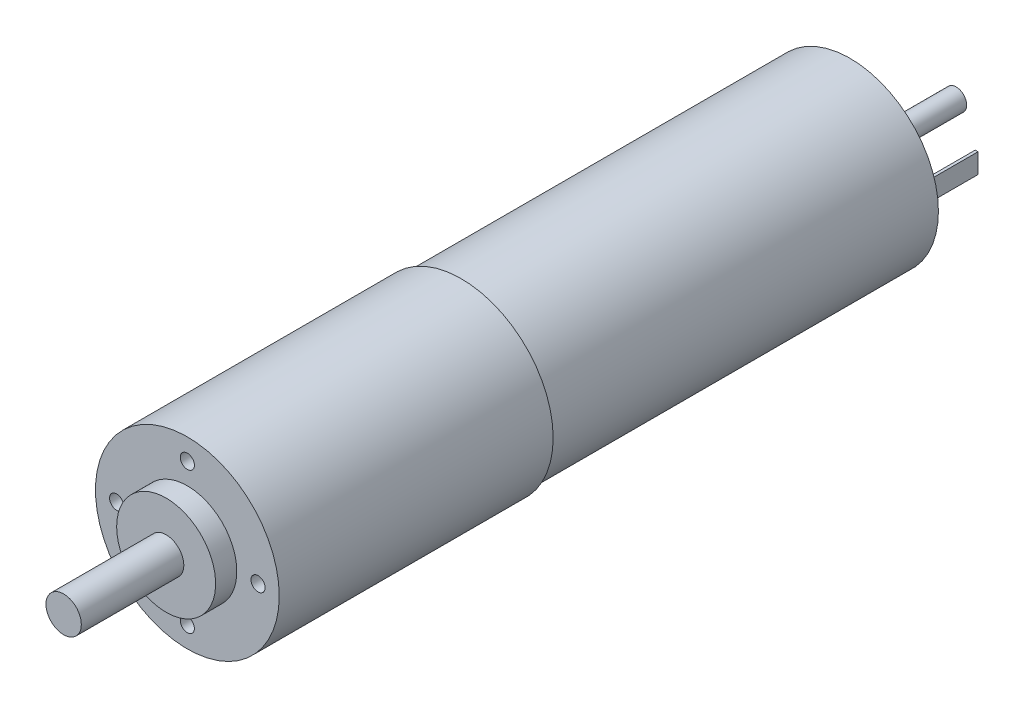
ISO-10303-21;
HEADER;
FILE_DESCRIPTION(('STEP AP214'),'2;1');
FILE_NAME('part.step','',(''),(''),'','','');
FILE_SCHEMA(('AUTOMOTIVE_DESIGN { 1 0 10303 214 1 1 1 1 }'));
ENDSEC;
DATA;
#1=APPLICATION_CONTEXT('core data for automotive mechanical design processes');
#2=APPLICATION_PROTOCOL_DEFINITION('international standard','automotive_design',2000,#1);
#3=PRODUCT_CONTEXT('',#1,'mechanical');
#4=PRODUCT('Part','Part','',(#3));
#5=PRODUCT_RELATED_PRODUCT_CATEGORY('part','',(#4));
#6=PRODUCT_DEFINITION_FORMATION('','',#4);
#7=PRODUCT_DEFINITION_CONTEXT('part definition',#1,'design');
#8=PRODUCT_DEFINITION('design','',#6,#7);
#9=PRODUCT_DEFINITION_SHAPE('','',#8);
#10=(LENGTH_UNIT() NAMED_UNIT(*) SI_UNIT(.MILLI.,.METRE.));
#11=(NAMED_UNIT(*) PLANE_ANGLE_UNIT() SI_UNIT($,.RADIAN.));
#12=(NAMED_UNIT(*) SI_UNIT($,.STERADIAN.) SOLID_ANGLE_UNIT());
#13=UNCERTAINTY_MEASURE_WITH_UNIT(LENGTH_MEASURE(1.E-05),#10,'distance_accuracy_value','');
#14=(GEOMETRIC_REPRESENTATION_CONTEXT(3) GLOBAL_UNCERTAINTY_ASSIGNED_CONTEXT((#13)) GLOBAL_UNIT_ASSIGNED_CONTEXT((#10,
#11,#12)) REPRESENTATION_CONTEXT('',''));
#15=CARTESIAN_POINT('',(0.,0.,0.));
#16=DIRECTION('',(0.,0.,1.));
#17=DIRECTION('',(1.,0.,0.));
#18=AXIS2_PLACEMENT_3D('',#15,#16,#17);
#19=CARTESIAN_POINT('',(0.,0.,0.));
#20=DIRECTION('',(0.,0.,1.));
#21=DIRECTION('',(1.,0.,0.));
#22=AXIS2_PLACEMENT_3D('',#19,#20,#21);
#23=PLANE('',#22);
#24=CARTESIAN_POINT('',(0.,0.,0.));
#25=DIRECTION('',(0.,0.,1.));
#26=DIRECTION('',(1.,0.,0.));
#27=AXIS2_PLACEMENT_3D('',#24,#25,#26);
#28=CIRCLE('',#27,12.5);
#29=CARTESIAN_POINT('',(12.5,0.,0.));
#30=VERTEX_POINT('',#29);
#31=EDGE_CURVE('E210',#30,#30,#28,.T.);
#32=ORIENTED_EDGE('',*,*,#31,.F.);
#33=EDGE_LOOP('',(#32));
#34=FACE_BOUND('',#33,.T.);
#35=CARTESIAN_POINT('',(0.,0.,0.));
#36=DIRECTION('',(0.,0.,-1.));
#37=DIRECTION('',(-1.,0.,0.));
#38=AXIS2_PLACEMENT_3D('',#35,#36,#37);
#39=CIRCLE('',#38,4.);
#40=CARTESIAN_POINT('',(-4.,0.,0.));
#41=VERTEX_POINT('',#40);
#42=EDGE_CURVE('E11',#41,#41,#39,.T.);
#43=ORIENTED_EDGE('',*,*,#42,.F.);
#44=EDGE_LOOP('',(#43));
#45=FACE_BOUND('',#44,.T.);
#46=DIRECTION('',(1.,0.,0.));
#47=VECTOR('',#46,1.);
#48=CARTESIAN_POINT('',(0.,-1.40000000000001,0.));
#49=LINE('',#48,#47);
#50=CARTESIAN_POINT('',(-9.4,-1.4,0.));
#51=VERTEX_POINT('',#50);
#52=CARTESIAN_POINT('',(-9.,-1.4,0.));
#53=VERTEX_POINT('',#52);
#54=EDGE_CURVE('E129',#51,#53,#49,.T.);
#55=ORIENTED_EDGE('',*,*,#54,.T.);
#56=DIRECTION('',(0.,1.,0.));
#57=VECTOR('',#56,1.);
#58=CARTESIAN_POINT('',(-9.,0.,0.));
#59=LINE('',#58,#57);
#60=CARTESIAN_POINT('',(-9.,1.4,0.));
#61=VERTEX_POINT('',#60);
#62=EDGE_CURVE('E126',#53,#61,#59,.T.);
#63=ORIENTED_EDGE('',*,*,#62,.T.);
#64=DIRECTION('',(-1.,0.,0.));
#65=VECTOR('',#64,1.);
#66=CARTESIAN_POINT('',(0.,1.40000000000001,0.));
#67=LINE('',#66,#65);
#68=CARTESIAN_POINT('',(-9.4,1.4,0.));
#69=VERTEX_POINT('',#68);
#70=EDGE_CURVE('E139',#61,#69,#67,.T.);
#71=ORIENTED_EDGE('',*,*,#70,.T.);
#72=DIRECTION('',(0.,-1.,0.));
#73=VECTOR('',#72,1.);
#74=CARTESIAN_POINT('',(-9.4,0.,0.));
#75=LINE('',#74,#73);
#76=EDGE_CURVE('E151',#69,#51,#75,.T.);
#77=ORIENTED_EDGE('',*,*,#76,.T.);
#78=EDGE_LOOP('',(#55,#63,#71,#77));
#79=FACE_BOUND('',#78,.T.);
#80=DIRECTION('',(-1.,0.,0.));
#81=VECTOR('',#80,1.);
#82=CARTESIAN_POINT('',(0.,-1.40000000000001,0.));
#83=LINE('',#82,#81);
#84=CARTESIAN_POINT('',(9.4,-1.4,0.));
#85=VERTEX_POINT('',#84);
#86=CARTESIAN_POINT('',(9.,-1.4,0.));
#87=VERTEX_POINT('',#86);
#88=EDGE_CURVE('E125',#85,#87,#83,.T.);
#89=ORIENTED_EDGE('',*,*,#88,.F.);
#90=DIRECTION('',(0.,-1.,0.));
#91=VECTOR('',#90,1.);
#92=CARTESIAN_POINT('',(9.4,0.,0.));
#93=LINE('',#92,#91);
#94=CARTESIAN_POINT('',(9.4,1.4,0.));
#95=VERTEX_POINT('',#94);
#96=EDGE_CURVE('E122',#95,#85,#93,.T.);
#97=ORIENTED_EDGE('',*,*,#96,.F.);
#98=DIRECTION('',(1.,0.,0.));
#99=VECTOR('',#98,1.);
#100=CARTESIAN_POINT('',(0.,1.40000000000001,0.));
#101=LINE('',#100,#99);
#102=CARTESIAN_POINT('',(9.,1.4,0.));
#103=VERTEX_POINT('',#102);
#104=EDGE_CURVE('E60',#103,#95,#101,.T.);
#105=ORIENTED_EDGE('',*,*,#104,.F.);
#106=DIRECTION('',(0.,1.,0.));
#107=VECTOR('',#106,1.);
#108=CARTESIAN_POINT('',(9.,0.,0.));
#109=LINE('',#108,#107);
#110=EDGE_CURVE('E55',#87,#103,#109,.T.);
#111=ORIENTED_EDGE('',*,*,#110,.F.);
#112=EDGE_LOOP('',(#89,#97,#105,#111));
#113=FACE_BOUND('',#112,.T.);
#114=ADVANCED_FACE('F38',(#34,#45,#79,#113),#23,.F.);
#115=CARTESIAN_POINT('',(0.,0.,55.));
#116=DIRECTION('',(0.,0.,-1.));
#117=DIRECTION('',(-1.,0.,0.));
#118=AXIS2_PLACEMENT_3D('',#115,#116,#117);
#119=CYLINDRICAL_SURFACE('',#118,12.5);
#120=CARTESIAN_POINT('',(0.,0.,55.));
#121=DIRECTION('',(0.,0.,1.));
#122=DIRECTION('',(1.,0.,0.));
#123=AXIS2_PLACEMENT_3D('',#120,#121,#122);
#124=CIRCLE('',#123,12.5);
#125=CARTESIAN_POINT('',(12.5,0.,55.));
#126=VERTEX_POINT('',#125);
#127=EDGE_CURVE('E206',#126,#126,#124,.T.);
#128=ORIENTED_EDGE('',*,*,#127,.F.);
#129=EDGE_LOOP('',(#128));
#130=FACE_BOUND('',#129,.T.);
#131=ORIENTED_EDGE('',*,*,#31,.T.);
#132=EDGE_LOOP('',(#131));
#133=FACE_BOUND('',#132,.T.);
#134=ADVANCED_FACE('F40',(#130,#133),#119,.T.);
#135=CARTESIAN_POINT('',(0.,0.,93.75));
#136=DIRECTION('',(0.,0.,-1.));
#137=DIRECTION('',(-1.,0.,0.));
#138=AXIS2_PLACEMENT_3D('',#135,#136,#137);
#139=CYLINDRICAL_SURFACE('',#138,13.);
#140=CARTESIAN_POINT('',(0.,0.,93.75));
#141=DIRECTION('',(0.,0.,1.));
#142=DIRECTION('',(1.,0.,0.));
#143=AXIS2_PLACEMENT_3D('',#140,#141,#142);
#144=CIRCLE('',#143,13.);
#145=CARTESIAN_POINT('',(13.,0.,93.75));
#146=VERTEX_POINT('',#145);
#147=EDGE_CURVE('E207',#146,#146,#144,.T.);
#148=ORIENTED_EDGE('',*,*,#147,.F.);
#149=EDGE_LOOP('',(#148));
#150=FACE_BOUND('',#149,.T.);
#151=CARTESIAN_POINT('',(0.,0.,55.));
#152=DIRECTION('',(0.,0.,1.));
#153=DIRECTION('',(1.,0.,0.));
#154=AXIS2_PLACEMENT_3D('',#151,#152,#153);
#155=CIRCLE('',#154,13.);
#156=CARTESIAN_POINT('',(13.,0.,55.));
#157=VERTEX_POINT('',#156);
#158=EDGE_CURVE('E203',#157,#157,#155,.T.);
#159=ORIENTED_EDGE('',*,*,#158,.T.);
#160=EDGE_LOOP('',(#159));
#161=FACE_BOUND('',#160,.T.);
#162=ADVANCED_FACE('F338',(#150,#161),#139,.T.);
#163=CARTESIAN_POINT('',(0.,0.,93.75));
#164=DIRECTION('',(0.,0.,1.));
#165=DIRECTION('',(1.,0.,0.));
#166=AXIS2_PLACEMENT_3D('',#163,#164,#165);
#167=PLANE('',#166);
#168=CARTESIAN_POINT('',(0.,10.,93.75));
#169=DIRECTION('',(0.,0.,1.));
#170=DIRECTION('',(1.,0.,0.));
#171=AXIS2_PLACEMENT_3D('',#168,#169,#170);
#172=CIRCLE('',#171,1.);
#173=CARTESIAN_POINT('',(1.,10.,93.75));
#174=VERTEX_POINT('',#173);
#175=EDGE_CURVE('E175',#174,#174,#172,.T.);
#176=ORIENTED_EDGE('',*,*,#175,.F.);
#177=EDGE_LOOP('',(#176));
#178=FACE_BOUND('',#177,.T.);
#179=CARTESIAN_POINT('',(10.,0.,93.75));
#180=DIRECTION('',(0.,0.,1.));
#181=DIRECTION('',(1.,0.,0.));
#182=AXIS2_PLACEMENT_3D('',#179,#180,#181);
#183=CIRCLE('',#182,0.999999999999999);
#184=CARTESIAN_POINT('',(11.,0.,93.75));
#185=VERTEX_POINT('',#184);
#186=EDGE_CURVE('E181',#185,#185,#183,.T.);
#187=ORIENTED_EDGE('',*,*,#186,.F.);
#188=EDGE_LOOP('',(#187));
#189=FACE_BOUND('',#188,.T.);
#190=CARTESIAN_POINT('',(0.,-10.,93.75));
#191=DIRECTION('',(0.,0.,1.));
#192=DIRECTION('',(1.,0.,0.));
#193=AXIS2_PLACEMENT_3D('',#190,#191,#192);
#194=CIRCLE('',#193,1.);
#195=CARTESIAN_POINT('',(1.,-10.,93.75));
#196=VERTEX_POINT('',#195);
#197=EDGE_CURVE('E187',#196,#196,#194,.T.);
#198=ORIENTED_EDGE('',*,*,#197,.F.);
#199=EDGE_LOOP('',(#198));
#200=FACE_BOUND('',#199,.T.);
#201=CARTESIAN_POINT('',(-10.,0.,93.75));
#202=DIRECTION('',(0.,0.,1.));
#203=DIRECTION('',(1.,0.,0.));
#204=AXIS2_PLACEMENT_3D('',#201,#202,#203);
#205=CIRCLE('',#204,0.999999999999999);
#206=CARTESIAN_POINT('',(-9.,0.,93.75));
#207=VERTEX_POINT('',#206);
#208=EDGE_CURVE('E169',#207,#207,#205,.T.);
#209=ORIENTED_EDGE('',*,*,#208,.F.);
#210=EDGE_LOOP('',(#209));
#211=FACE_BOUND('',#210,.T.);
#212=CARTESIAN_POINT('',(0.,0.,93.75));
#213=DIRECTION('',(0.,0.,1.));
#214=DIRECTION('',(1.,0.,0.));
#215=AXIS2_PLACEMENT_3D('',#212,#213,#214);
#216=CIRCLE('',#215,7.);
#217=CARTESIAN_POINT('',(-7.,0.,93.75));
#218=VERTEX_POINT('',#217);
#219=EDGE_CURVE('E200',#218,#218,#216,.T.);
#220=ORIENTED_EDGE('',*,*,#219,.F.);
#221=EDGE_LOOP('',(#220));
#222=FACE_BOUND('',#221,.T.);
#223=ORIENTED_EDGE('',*,*,#147,.T.);
#224=EDGE_LOOP('',(#223));
#225=FACE_BOUND('',#224,.T.);
#226=ADVANCED_FACE('F335',(#178,#189,#200,#211,#222,#225),#167,.T.);
#227=CARTESIAN_POINT('',(0.,0.,55.));
#228=DIRECTION('',(0.,0.,1.));
#229=DIRECTION('',(1.,0.,0.));
#230=AXIS2_PLACEMENT_3D('',#227,#228,#229);
#231=PLANE('',#230);
#232=ORIENTED_EDGE('',*,*,#127,.T.);
#233=EDGE_LOOP('',(#232));
#234=FACE_BOUND('',#233,.T.);
#235=ORIENTED_EDGE('',*,*,#158,.F.);
#236=EDGE_LOOP('',(#235));
#237=FACE_BOUND('',#236,.T.);
#238=ADVANCED_FACE('F333',(#234,#237),#231,.F.);
#239=CARTESIAN_POINT('',(0.,0.,96.75));
#240=DIRECTION('',(0.,0.,-1.));
#241=DIRECTION('',(-1.,0.,0.));
#242=AXIS2_PLACEMENT_3D('',#239,#240,#241);
#243=CYLINDRICAL_SURFACE('',#242,7.);
#244=CARTESIAN_POINT('',(0.,0.,96.75));
#245=DIRECTION('',(0.,0.,1.));
#246=DIRECTION('',(1.,0.,0.));
#247=AXIS2_PLACEMENT_3D('',#244,#245,#246);
#248=CIRCLE('',#247,7.);
#249=CARTESIAN_POINT('',(-7.,0.,96.75));
#250=VERTEX_POINT('',#249);
#251=EDGE_CURVE('E197',#250,#250,#248,.T.);
#252=CARTESIAN_POINT('',(-7.,0.,96.75));
#253=CARTESIAN_POINT('',(-7.,0.,96.71875));
#254=CARTESIAN_POINT('',(-7.,0.,96.6875));
#255=CARTESIAN_POINT('',(-7.,0.,96.625));
#256=CARTESIAN_POINT('',(-7.,0.,96.59375));
#257=CARTESIAN_POINT('',(-7.,0.,96.53125));
#258=CARTESIAN_POINT('',(-7.,0.,96.5));
#259=CARTESIAN_POINT('',(-7.,0.,96.4375));
#260=CARTESIAN_POINT('',(-7.,0.,96.40625));
#261=CARTESIAN_POINT('',(-7.,0.,96.34375));
#262=CARTESIAN_POINT('',(-7.,0.,96.3125));
#263=CARTESIAN_POINT('',(-7.,0.,96.25));
#264=CARTESIAN_POINT('',(-7.,0.,96.21875));
#265=CARTESIAN_POINT('',(-7.,0.,96.15625));
#266=CARTESIAN_POINT('',(-7.,0.,96.125));
#267=CARTESIAN_POINT('',(-7.,0.,96.0625));
#268=CARTESIAN_POINT('',(-7.,0.,96.03125));
#269=CARTESIAN_POINT('',(-7.,0.,95.96875));
#270=CARTESIAN_POINT('',(-7.,0.,95.9375));
#271=CARTESIAN_POINT('',(-7.,0.,95.875));
#272=CARTESIAN_POINT('',(-7.,0.,95.84375));
#273=CARTESIAN_POINT('',(-7.,0.,95.78125));
#274=CARTESIAN_POINT('',(-7.,0.,95.75));
#275=CARTESIAN_POINT('',(-7.,0.,95.6875));
#276=CARTESIAN_POINT('',(-7.,0.,95.65625));
#277=CARTESIAN_POINT('',(-7.,0.,95.59375));
#278=CARTESIAN_POINT('',(-7.,0.,95.5625));
#279=CARTESIAN_POINT('',(-7.,0.,95.5));
#280=CARTESIAN_POINT('',(-7.,0.,95.46875));
#281=CARTESIAN_POINT('',(-7.,0.,95.40625));
#282=CARTESIAN_POINT('',(-7.,0.,95.375));
#283=CARTESIAN_POINT('',(-7.,0.,95.3125));
#284=CARTESIAN_POINT('',(-7.,0.,95.28125));
#285=CARTESIAN_POINT('',(-7.,0.,95.21875));
#286=CARTESIAN_POINT('',(-7.,0.,95.1875));
#287=CARTESIAN_POINT('',(-7.,0.,95.125));
#288=CARTESIAN_POINT('',(-7.,0.,95.09375));
#289=CARTESIAN_POINT('',(-7.,0.,95.03125));
#290=CARTESIAN_POINT('',(-7.,0.,95.));
#291=CARTESIAN_POINT('',(-7.,0.,94.9375));
#292=CARTESIAN_POINT('',(-7.,0.,94.90625));
#293=CARTESIAN_POINT('',(-7.,0.,94.84375));
#294=CARTESIAN_POINT('',(-7.,0.,94.8125));
#295=CARTESIAN_POINT('',(-7.,0.,94.75));
#296=CARTESIAN_POINT('',(-7.,0.,94.71875));
#297=CARTESIAN_POINT('',(-7.,0.,94.65625));
#298=CARTESIAN_POINT('',(-7.,0.,94.625));
#299=CARTESIAN_POINT('',(-7.,0.,94.5625));
#300=CARTESIAN_POINT('',(-7.,0.,94.53125));
#301=CARTESIAN_POINT('',(-7.,0.,94.46875));
#302=CARTESIAN_POINT('',(-7.,0.,94.4375));
#303=CARTESIAN_POINT('',(-7.,0.,94.375));
#304=CARTESIAN_POINT('',(-7.,0.,94.34375));
#305=CARTESIAN_POINT('',(-7.,0.,94.28125));
#306=CARTESIAN_POINT('',(-7.,0.,94.25));
#307=CARTESIAN_POINT('',(-7.,0.,94.1875));
#308=CARTESIAN_POINT('',(-7.,0.,94.15625));
#309=CARTESIAN_POINT('',(-7.,0.,94.09375));
#310=CARTESIAN_POINT('',(-7.,0.,94.0625));
#311=CARTESIAN_POINT('',(-7.,0.,94.));
#312=CARTESIAN_POINT('',(-7.,0.,93.96875));
#313=CARTESIAN_POINT('',(-7.,0.,93.90625));
#314=CARTESIAN_POINT('',(-7.,0.,93.875));
#315=CARTESIAN_POINT('',(-7.,0.,93.8125));
#316=CARTESIAN_POINT('',(-7.,0.,93.78125));
#317=CARTESIAN_POINT('',(-7.,0.,93.75));
#318=B_SPLINE_CURVE_WITH_KNOTS('',3,(#252,#253,#254,#255,#256,#257,#258,#259,#260,#261,#262,
#263,#264,#265,#266,#267,#268,#269,#270,#271,#272,#273,#274,#275,#276,#277,#278,#279,#280,#281,
#282,#283,#284,#285,#286,#287,#288,#289,#290,#291,#292,#293,#294,#295,#296,#297,#298,#299,#300,
#301,#302,#303,#304,#305,#306,#307,#308,#309,#310,#311,#312,#313,#314,#315,#316,#317),
.UNSPECIFIED.,.F.,.F.,(4,2,2,2,2,2,2,2,2,2,2,2,2,2,2,2,2,2,2,2,2,2,2,2,2,2,2,2,2,2,2,2,4),(0.,
0.0937499999999897,0.187499999999993,0.281249999999997,0.375,0.46874999999999,0.562499999999994,
0.656249999999997,0.750000000000001,0.84374999999999,0.937499999999994,1.03125,1.125,
1.21874999999999,1.31249999999999,1.40625,1.5,1.59374999999999,1.68749999999999,1.78125,1.875,
1.96874999999999,2.06249999999999,2.15625,2.25,2.34374999999999,2.4375,2.53125,2.625,
2.71874999999999,2.8125,2.90625,3.),.UNSPECIFIED.);
#319=EDGE_CURVE('BSEAM329',#250,#218,#318,.T.);
#320=ORIENTED_EDGE('',*,*,#251,.F.);
#321=ORIENTED_EDGE('',*,*,#219,.T.);
#322=ORIENTED_EDGE('',*,*,#319,.T.);
#323=ORIENTED_EDGE('',*,*,#319,.F.);
#324=EDGE_LOOP('',(#320,#322,#321,#323));
#325=FACE_BOUND('',#324,.T.);
#326=ADVANCED_FACE('F329',(#325),#243,.T.);
#327=CARTESIAN_POINT('',(0.,0.,96.75));
#328=DIRECTION('',(0.,0.,1.));
#329=DIRECTION('',(1.,0.,0.));
#330=AXIS2_PLACEMENT_3D('',#327,#328,#329);
#331=PLANE('',#330);
#332=CARTESIAN_POINT('',(0.,0.,96.75));
#333=DIRECTION('',(0.,0.,1.));
#334=DIRECTION('',(1.,0.,0.));
#335=AXIS2_PLACEMENT_3D('',#332,#333,#334);
#336=CIRCLE('',#335,2.5);
#337=CARTESIAN_POINT('',(2.5,0.,96.75));
#338=VERTEX_POINT('',#337);
#339=EDGE_CURVE('E47',#338,#338,#336,.T.);
#340=ORIENTED_EDGE('',*,*,#339,.F.);
#341=EDGE_LOOP('',(#340));
#342=FACE_BOUND('',#341,.T.);
#343=ORIENTED_EDGE('',*,*,#251,.T.);
#344=EDGE_LOOP('',(#343));
#345=FACE_BOUND('',#344,.T.);
#346=ADVANCED_FACE('F325',(#342,#345),#331,.T.);
#347=CARTESIAN_POINT('',(0.,0.,111.25));
#348=DIRECTION('',(0.,0.,-1.));
#349=DIRECTION('',(-1.,0.,0.));
#350=AXIS2_PLACEMENT_3D('',#347,#348,#349);
#351=CYLINDRICAL_SURFACE('',#350,2.5);
#352=CARTESIAN_POINT('',(0.,0.,111.25));
#353=DIRECTION('',(0.,0.,1.));
#354=DIRECTION('',(1.,0.,0.));
#355=AXIS2_PLACEMENT_3D('',#352,#353,#354);
#356=CIRCLE('',#355,2.5);
#357=CARTESIAN_POINT('',(2.5,0.,111.25));
#358=VERTEX_POINT('',#357);
#359=EDGE_CURVE('E174',#358,#358,#356,.T.);
#360=ORIENTED_EDGE('',*,*,#359,.F.);
#361=EDGE_LOOP('',(#360));
#362=FACE_BOUND('',#361,.T.);
#363=ORIENTED_EDGE('',*,*,#339,.T.);
#364=EDGE_LOOP('',(#363));
#365=FACE_BOUND('',#364,.T.);
#366=ADVANCED_FACE('F321',(#362,#365),#351,.T.);
#367=CARTESIAN_POINT('',(0.,0.,111.25));
#368=DIRECTION('',(0.,0.,1.));
#369=DIRECTION('',(1.,0.,0.));
#370=AXIS2_PLACEMENT_3D('',#367,#368,#369);
#371=PLANE('',#370);
#372=ORIENTED_EDGE('',*,*,#359,.T.);
#373=EDGE_LOOP('',(#372));
#374=FACE_BOUND('',#373,.T.);
#375=ADVANCED_FACE('F317',(#374),#371,.T.);
#376=CARTESIAN_POINT('',(-10.,0.,89.75));
#377=DIRECTION('',(0.,0.,1.));
#378=DIRECTION('',(1.,0.,0.));
#379=AXIS2_PLACEMENT_3D('',#376,#377,#378);
#380=CYLINDRICAL_SURFACE('',#379,0.999999999999999);
#381=CARTESIAN_POINT('',(-10.,0.,89.75));
#382=DIRECTION('',(0.,0.,1.));
#383=DIRECTION('',(1.,0.,0.));
#384=AXIS2_PLACEMENT_3D('',#381,#382,#383);
#385=CIRCLE('',#384,0.999999999999999);
#386=CARTESIAN_POINT('',(-9.,0.,89.75));
#387=VERTEX_POINT('',#386);
#388=EDGE_CURVE('E190',#387,#387,#385,.T.);
#389=ORIENTED_EDGE('',*,*,#388,.F.);
#390=EDGE_LOOP('',(#389));
#391=FACE_BOUND('',#390,.T.);
#392=ORIENTED_EDGE('',*,*,#208,.T.);
#393=EDGE_LOOP('',(#392));
#394=FACE_BOUND('',#393,.T.);
#395=ADVANCED_FACE('F313',(#391,#394),#380,.F.);
#396=CARTESIAN_POINT('',(0.,0.,89.75));
#397=DIRECTION('',(0.,0.,1.));
#398=DIRECTION('',(1.,0.,0.));
#399=AXIS2_PLACEMENT_3D('',#396,#397,#398);
#400=PLANE('',#399);
#401=ORIENTED_EDGE('',*,*,#388,.T.);
#402=EDGE_LOOP('',(#401));
#403=FACE_BOUND('',#402,.T.);
#404=ADVANCED_FACE('F309',(#403),#400,.T.);
#405=CARTESIAN_POINT('',(0.,-10.,89.75));
#406=DIRECTION('',(0.,0.,1.));
#407=DIRECTION('',(1.,0.,0.));
#408=AXIS2_PLACEMENT_3D('',#405,#406,#407);
#409=CYLINDRICAL_SURFACE('',#408,1.);
#410=CARTESIAN_POINT('',(0.,-10.,89.75));
#411=DIRECTION('',(0.,0.,1.));
#412=DIRECTION('',(1.,0.,0.));
#413=AXIS2_PLACEMENT_3D('',#410,#411,#412);
#414=CIRCLE('',#413,1.);
#415=CARTESIAN_POINT('',(1.,-10.,89.75));
#416=VERTEX_POINT('',#415);
#417=EDGE_CURVE('E184',#416,#416,#414,.T.);
#418=ORIENTED_EDGE('',*,*,#417,.F.);
#419=EDGE_LOOP('',(#418));
#420=FACE_BOUND('',#419,.T.);
#421=ORIENTED_EDGE('',*,*,#197,.T.);
#422=EDGE_LOOP('',(#421));
#423=FACE_BOUND('',#422,.T.);
#424=ADVANCED_FACE('F305',(#420,#423),#409,.F.);
#425=CARTESIAN_POINT('',(0.,0.,89.75));
#426=DIRECTION('',(0.,0.,1.));
#427=DIRECTION('',(1.,0.,0.));
#428=AXIS2_PLACEMENT_3D('',#425,#426,#427);
#429=PLANE('',#428);
#430=ORIENTED_EDGE('',*,*,#417,.T.);
#431=EDGE_LOOP('',(#430));
#432=FACE_BOUND('',#431,.T.);
#433=ADVANCED_FACE('F301',(#432),#429,.T.);
#434=CARTESIAN_POINT('',(10.,0.,89.75));
#435=DIRECTION('',(0.,0.,1.));
#436=DIRECTION('',(1.,0.,0.));
#437=AXIS2_PLACEMENT_3D('',#434,#435,#436);
#438=CYLINDRICAL_SURFACE('',#437,0.999999999999999);
#439=CARTESIAN_POINT('',(10.,0.,89.75));
#440=DIRECTION('',(0.,0.,1.));
#441=DIRECTION('',(1.,0.,0.));
#442=AXIS2_PLACEMENT_3D('',#439,#440,#441);
#443=CIRCLE('',#442,0.999999999999999);
#444=CARTESIAN_POINT('',(11.,0.,89.75));
#445=VERTEX_POINT('',#444);
#446=EDGE_CURVE('E178',#445,#445,#443,.T.);
#447=ORIENTED_EDGE('',*,*,#446,.F.);
#448=EDGE_LOOP('',(#447));
#449=FACE_BOUND('',#448,.T.);
#450=ORIENTED_EDGE('',*,*,#186,.T.);
#451=EDGE_LOOP('',(#450));
#452=FACE_BOUND('',#451,.T.);
#453=ADVANCED_FACE('F297',(#449,#452),#438,.F.);
#454=CARTESIAN_POINT('',(0.,0.,89.75));
#455=DIRECTION('',(0.,0.,1.));
#456=DIRECTION('',(1.,0.,0.));
#457=AXIS2_PLACEMENT_3D('',#454,#455,#456);
#458=PLANE('',#457);
#459=ORIENTED_EDGE('',*,*,#446,.T.);
#460=EDGE_LOOP('',(#459));
#461=FACE_BOUND('',#460,.T.);
#462=ADVANCED_FACE('F293',(#461),#458,.T.);
#463=CARTESIAN_POINT('',(0.,10.,89.75));
#464=DIRECTION('',(0.,0.,1.));
#465=DIRECTION('',(1.,0.,0.));
#466=AXIS2_PLACEMENT_3D('',#463,#464,#465);
#467=CYLINDRICAL_SURFACE('',#466,1.);
#468=CARTESIAN_POINT('',(0.,10.,89.75));
#469=DIRECTION('',(0.,0.,1.));
#470=DIRECTION('',(1.,0.,0.));
#471=AXIS2_PLACEMENT_3D('',#468,#469,#470);
#472=CIRCLE('',#471,1.);
#473=CARTESIAN_POINT('',(1.,10.,89.75));
#474=VERTEX_POINT('',#473);
#475=EDGE_CURVE('E171',#474,#474,#472,.T.);
#476=ORIENTED_EDGE('',*,*,#475,.F.);
#477=EDGE_LOOP('',(#476));
#478=FACE_BOUND('',#477,.T.);
#479=ORIENTED_EDGE('',*,*,#175,.T.);
#480=EDGE_LOOP('',(#479));
#481=FACE_BOUND('',#480,.T.);
#482=ADVANCED_FACE('F289',(#478,#481),#467,.F.);
#483=CARTESIAN_POINT('',(0.,0.,89.75));
#484=DIRECTION('',(0.,0.,1.));
#485=DIRECTION('',(1.,0.,0.));
#486=AXIS2_PLACEMENT_3D('',#483,#484,#485);
#487=PLANE('',#486);
#488=ORIENTED_EDGE('',*,*,#475,.T.);
#489=EDGE_LOOP('',(#488));
#490=FACE_BOUND('',#489,.T.);
#491=ADVANCED_FACE('F285',(#490),#487,.T.);
#492=CARTESIAN_POINT('',(0.,0.,-2.75));
#493=DIRECTION('',(0.,0.,1.));
#494=DIRECTION('',(1.,0.,0.));
#495=AXIS2_PLACEMENT_3D('',#492,#493,#494);
#496=CYLINDRICAL_SURFACE('',#495,4.);
#497=CARTESIAN_POINT('',(0.,0.,-2.75));
#498=DIRECTION('',(0.,0.,-1.));
#499=DIRECTION('',(-1.,0.,0.));
#500=AXIS2_PLACEMENT_3D('',#497,#498,#499);
#501=CIRCLE('',#500,4.);
#502=CARTESIAN_POINT('',(-4.,0.,-2.75));
#503=VERTEX_POINT('',#502);
#504=EDGE_CURVE('E167',#503,#503,#501,.T.);
#505=ORIENTED_EDGE('',*,*,#504,.F.);
#506=EDGE_LOOP('',(#505));
#507=FACE_BOUND('',#506,.T.);
#508=ORIENTED_EDGE('',*,*,#42,.T.);
#509=EDGE_LOOP('',(#508));
#510=FACE_BOUND('',#509,.T.);
#511=ADVANCED_FACE('F281',(#507,#510),#496,.T.);
#512=CARTESIAN_POINT('',(0.,0.,-2.75));
#513=DIRECTION('',(0.,0.,-1.));
#514=DIRECTION('',(-1.,0.,0.));
#515=AXIS2_PLACEMENT_3D('',#512,#513,#514);
#516=PLANE('',#515);
#517=CARTESIAN_POINT('',(0.,0.,-2.75));
#518=DIRECTION('',(0.,0.,-1.));
#519=DIRECTION('',(-1.,0.,0.));
#520=AXIS2_PLACEMENT_3D('',#517,#518,#519);
#521=CIRCLE('',#520,1.5);
#522=CARTESIAN_POINT('',(-1.5,0.,-2.75));
#523=VERTEX_POINT('',#522);
#524=EDGE_CURVE('E42',#523,#523,#521,.F.);
#525=ORIENTED_EDGE('',*,*,#524,.T.);
#526=EDGE_LOOP('',(#525));
#527=FACE_BOUND('',#526,.T.);
#528=ORIENTED_EDGE('',*,*,#504,.T.);
#529=EDGE_LOOP('',(#528));
#530=FACE_BOUND('',#529,.T.);
#531=ADVANCED_FACE('F277',(#527,#530),#516,.T.);
#532=CARTESIAN_POINT('',(0.,0.,-15.));
#533=DIRECTION('',(0.,0.,1.));
#534=DIRECTION('',(1.,0.,0.));
#535=AXIS2_PLACEMENT_3D('',#532,#533,#534);
#536=CYLINDRICAL_SURFACE('',#535,1.5);
#537=ORIENTED_EDGE('',*,*,#524,.F.);
#538=EDGE_LOOP('',(#537));
#539=FACE_BOUND('',#538,.T.);
#540=CARTESIAN_POINT('',(0.,0.,-15.));
#541=DIRECTION('',(0.,0.,-1.));
#542=DIRECTION('',(-1.,0.,0.));
#543=AXIS2_PLACEMENT_3D('',#540,#541,#542);
#544=CIRCLE('',#543,1.5);
#545=CARTESIAN_POINT('',(-1.5,0.,-15.));
#546=VERTEX_POINT('',#545);
#547=EDGE_CURVE('E164',#546,#546,#544,.T.);
#548=ORIENTED_EDGE('',*,*,#547,.F.);
#549=EDGE_LOOP('',(#548));
#550=FACE_BOUND('',#549,.T.);
#551=ADVANCED_FACE('F273',(#539,#550),#536,.T.);
#552=CARTESIAN_POINT('',(0.,0.,-15.));
#553=DIRECTION('',(0.,0.,-1.));
#554=DIRECTION('',(-1.,0.,0.));
#555=AXIS2_PLACEMENT_3D('',#552,#553,#554);
#556=PLANE('',#555);
#557=ORIENTED_EDGE('',*,*,#547,.T.);
#558=EDGE_LOOP('',(#557));
#559=FACE_BOUND('',#558,.T.);
#560=ADVANCED_FACE('F269',(#559),#556,.T.);
#561=CARTESIAN_POINT('',(-9.,0.,-8.7));
#562=DIRECTION('',(1.,0.,0.));
#563=DIRECTION('',(0.,0.,-1.));
#564=AXIS2_PLACEMENT_3D('',#561,#562,#563);
#565=PLANE('',#564);
#566=ORIENTED_EDGE('',*,*,#62,.F.);
#567=DIRECTION('',(0.,0.,1.));
#568=VECTOR('',#567,1.);
#569=CARTESIAN_POINT('',(-9.,-1.4,-8.7));
#570=LINE('',#569,#568);
#571=CARTESIAN_POINT('',(-9.,-1.4,-8.7));
#572=VERTEX_POINT('',#571);
#573=EDGE_CURVE('E162',#572,#53,#570,.T.);
#574=ORIENTED_EDGE('',*,*,#573,.F.);
#575=DIRECTION('',(0.,1.,0.));
#576=VECTOR('',#575,1.);
#577=CARTESIAN_POINT('',(-9.,0.,-8.7));
#578=LINE('',#577,#576);
#579=CARTESIAN_POINT('',(-9.,1.4,-8.7));
#580=VERTEX_POINT('',#579);
#581=EDGE_CURVE('E135',#572,#580,#578,.T.);
#582=ORIENTED_EDGE('',*,*,#581,.T.);
#583=DIRECTION('',(0.,0.,1.));
#584=VECTOR('',#583,1.);
#585=CARTESIAN_POINT('',(-9.,1.4,-8.7));
#586=LINE('',#585,#584);
#587=EDGE_CURVE('E147',#580,#61,#586,.T.);
#588=ORIENTED_EDGE('',*,*,#587,.T.);
#589=EDGE_LOOP('',(#566,#574,#582,#588));
#590=FACE_BOUND('',#589,.T.);
#591=ADVANCED_FACE('F265',(#590),#565,.T.);
#592=CARTESIAN_POINT('',(0.,-1.40000000000001,-8.7));
#593=DIRECTION('',(0.,-1.,0.));
#594=DIRECTION('',(1.,0.,0.));
#595=AXIS2_PLACEMENT_3D('',#592,#593,#594);
#596=PLANE('',#595);
#597=ORIENTED_EDGE('',*,*,#54,.F.);
#598=DIRECTION('',(0.,0.,1.));
#599=VECTOR('',#598,1.);
#600=CARTESIAN_POINT('',(-9.4,-1.4,-8.7));
#601=LINE('',#600,#599);
#602=CARTESIAN_POINT('',(-9.4,-1.4,-8.7));
#603=VERTEX_POINT('',#602);
#604=EDGE_CURVE('E160',#603,#51,#601,.T.);
#605=ORIENTED_EDGE('',*,*,#604,.F.);
#606=DIRECTION('',(1.,0.,0.));
#607=VECTOR('',#606,1.);
#608=CARTESIAN_POINT('',(0.,-1.40000000000001,-8.7));
#609=LINE('',#608,#607);
#610=EDGE_CURVE('E138',#603,#572,#609,.T.);
#611=ORIENTED_EDGE('',*,*,#610,.T.);
#612=ORIENTED_EDGE('',*,*,#573,.T.);
#613=EDGE_LOOP('',(#597,#605,#611,#612));
#614=FACE_BOUND('',#613,.T.);
#615=ADVANCED_FACE('F261',(#614),#596,.T.);
#616=CARTESIAN_POINT('',(-9.4,0.,-8.7));
#617=DIRECTION('',(-1.,0.,0.));
#618=DIRECTION('',(0.,-1.,0.));
#619=AXIS2_PLACEMENT_3D('',#616,#617,#618);
#620=PLANE('',#619);
#621=ORIENTED_EDGE('',*,*,#76,.F.);
#622=DIRECTION('',(0.,0.,1.));
#623=VECTOR('',#622,1.);
#624=CARTESIAN_POINT('',(-9.4,1.4,-8.7));
#625=LINE('',#624,#623);
#626=CARTESIAN_POINT('',(-9.4,1.4,-8.7));
#627=VERTEX_POINT('',#626);
#628=EDGE_CURVE('E157',#627,#69,#625,.T.);
#629=ORIENTED_EDGE('',*,*,#628,.F.);
#630=DIRECTION('',(0.,-1.,0.));
#631=VECTOR('',#630,1.);
#632=CARTESIAN_POINT('',(-9.4,0.,-8.7));
#633=LINE('',#632,#631);
#634=EDGE_CURVE('E142',#627,#603,#633,.T.);
#635=ORIENTED_EDGE('',*,*,#634,.T.);
#636=ORIENTED_EDGE('',*,*,#604,.T.);
#637=EDGE_LOOP('',(#621,#629,#635,#636));
#638=FACE_BOUND('',#637,.T.);
#639=ADVANCED_FACE('F257',(#638),#620,.T.);
#640=CARTESIAN_POINT('',(0.,1.40000000000001,-8.7));
#641=DIRECTION('',(0.,1.,0.));
#642=DIRECTION('',(-1.,0.,0.));
#643=AXIS2_PLACEMENT_3D('',#640,#641,#642);
#644=PLANE('',#643);
#645=ORIENTED_EDGE('',*,*,#70,.F.);
#646=ORIENTED_EDGE('',*,*,#587,.F.);
#647=DIRECTION('',(-1.,0.,0.));
#648=VECTOR('',#647,1.);
#649=CARTESIAN_POINT('',(0.,1.40000000000001,-8.7));
#650=LINE('',#649,#648);
#651=EDGE_CURVE('E145',#580,#627,#650,.T.);
#652=ORIENTED_EDGE('',*,*,#651,.T.);
#653=ORIENTED_EDGE('',*,*,#628,.T.);
#654=EDGE_LOOP('',(#645,#646,#652,#653));
#655=FACE_BOUND('',#654,.T.);
#656=ADVANCED_FACE('F253',(#655),#644,.T.);
#657=CARTESIAN_POINT('',(0.,0.,-8.7));
#658=DIRECTION('',(0.,0.,-1.));
#659=DIRECTION('',(-1.,0.,0.));
#660=AXIS2_PLACEMENT_3D('',#657,#658,#659);
#661=PLANE('',#660);
#662=ORIENTED_EDGE('',*,*,#581,.F.);
#663=ORIENTED_EDGE('',*,*,#610,.F.);
#664=ORIENTED_EDGE('',*,*,#634,.F.);
#665=ORIENTED_EDGE('',*,*,#651,.F.);
#666=EDGE_LOOP('',(#662,#663,#664,#665));
#667=FACE_BOUND('',#666,.T.);
#668=ADVANCED_FACE('F250',(#667),#661,.T.);
#669=CARTESIAN_POINT('',(0.,-1.40000000000001,-8.7));
#670=DIRECTION('',(0.,1.,0.));
#671=DIRECTION('',(-1.,0.,0.));
#672=AXIS2_PLACEMENT_3D('',#669,#670,#671);
#673=PLANE('',#672);
#674=ORIENTED_EDGE('',*,*,#88,.T.);
#675=DIRECTION('',(0.,0.,1.));
#676=VECTOR('',#675,1.);
#677=CARTESIAN_POINT('',(9.,-1.4,-8.7));
#678=LINE('',#677,#676);
#679=CARTESIAN_POINT('',(9.,-1.4,-8.7));
#680=VERTEX_POINT('',#679);
#681=EDGE_CURVE('E106',#680,#87,#678,.T.);
#682=ORIENTED_EDGE('',*,*,#681,.F.);
#683=DIRECTION('',(-1.,0.,0.));
#684=VECTOR('',#683,1.);
#685=CARTESIAN_POINT('',(0.,-1.40000000000001,-8.7));
#686=LINE('',#685,#684);
#687=CARTESIAN_POINT('',(9.4,-1.4,-8.7));
#688=VERTEX_POINT('',#687);
#689=EDGE_CURVE('E113',#688,#680,#686,.T.);
#690=ORIENTED_EDGE('',*,*,#689,.F.);
#691=DIRECTION('',(0.,0.,1.));
#692=VECTOR('',#691,1.);
#693=CARTESIAN_POINT('',(9.4,-1.4,-8.7));
#694=LINE('',#693,#692);
#695=EDGE_CURVE('E228',#688,#85,#694,.T.);
#696=ORIENTED_EDGE('',*,*,#695,.T.);
#697=EDGE_LOOP('',(#674,#682,#690,#696));
#698=FACE_BOUND('',#697,.T.);
#699=ADVANCED_FACE('F124',(#698),#673,.F.);
#700=CARTESIAN_POINT('',(9.,0.,-8.7));
#701=DIRECTION('',(1.,0.,0.));
#702=DIRECTION('',(0.,0.,-1.));
#703=AXIS2_PLACEMENT_3D('',#700,#701,#702);
#704=PLANE('',#703);
#705=ORIENTED_EDGE('',*,*,#110,.T.);
#706=DIRECTION('',(0.,0.,1.));
#707=VECTOR('',#706,1.);
#708=CARTESIAN_POINT('',(9.,1.4,-8.7));
#709=LINE('',#708,#707);
#710=CARTESIAN_POINT('',(9.,1.4,-8.7));
#711=VERTEX_POINT('',#710);
#712=EDGE_CURVE('E109',#711,#103,#709,.T.);
#713=ORIENTED_EDGE('',*,*,#712,.F.);
#714=DIRECTION('',(0.,1.,0.));
#715=VECTOR('',#714,1.);
#716=CARTESIAN_POINT('',(9.,0.,-8.7));
#717=LINE('',#716,#715);
#718=EDGE_CURVE('E102',#680,#711,#717,.T.);
#719=ORIENTED_EDGE('',*,*,#718,.F.);
#720=ORIENTED_EDGE('',*,*,#681,.T.);
#721=EDGE_LOOP('',(#705,#713,#719,#720));
#722=FACE_BOUND('',#721,.T.);
#723=ADVANCED_FACE('F104',(#722),#704,.F.);
#724=CARTESIAN_POINT('',(0.,1.40000000000001,-8.7));
#725=DIRECTION('',(0.,-1.,0.));
#726=DIRECTION('',(1.,0.,0.));
#727=AXIS2_PLACEMENT_3D('',#724,#725,#726);
#728=PLANE('',#727);
#729=ORIENTED_EDGE('',*,*,#104,.T.);
#730=DIRECTION('',(0.,0.,1.));
#731=VECTOR('',#730,1.);
#732=CARTESIAN_POINT('',(9.4,1.4,-8.7));
#733=LINE('',#732,#731);
#734=CARTESIAN_POINT('',(9.4,1.4,-8.7));
#735=VERTEX_POINT('',#734);
#736=EDGE_CURVE('E131',#735,#95,#733,.T.);
#737=ORIENTED_EDGE('',*,*,#736,.F.);
#738=DIRECTION('',(1.,0.,0.));
#739=VECTOR('',#738,1.);
#740=CARTESIAN_POINT('',(0.,1.40000000000001,-8.7));
#741=LINE('',#740,#739);
#742=EDGE_CURVE('E112',#711,#735,#741,.T.);
#743=ORIENTED_EDGE('',*,*,#742,.F.);
#744=ORIENTED_EDGE('',*,*,#712,.T.);
#745=EDGE_LOOP('',(#729,#737,#743,#744));
#746=FACE_BOUND('',#745,.T.);
#747=ADVANCED_FACE('F237',(#746),#728,.F.);
#748=CARTESIAN_POINT('',(9.4,0.,-8.7));
#749=DIRECTION('',(-1.,0.,0.));
#750=DIRECTION('',(0.,-1.,0.));
#751=AXIS2_PLACEMENT_3D('',#748,#749,#750);
#752=PLANE('',#751);
#753=ORIENTED_EDGE('',*,*,#96,.T.);
#754=ORIENTED_EDGE('',*,*,#695,.F.);
#755=DIRECTION('',(0.,-1.,0.));
#756=VECTOR('',#755,1.);
#757=CARTESIAN_POINT('',(9.4,0.,-8.7));
#758=LINE('',#757,#756);
#759=EDGE_CURVE('E118',#735,#688,#758,.T.);
#760=ORIENTED_EDGE('',*,*,#759,.F.);
#761=ORIENTED_EDGE('',*,*,#736,.T.);
#762=EDGE_LOOP('',(#753,#754,#760,#761));
#763=FACE_BOUND('',#762,.T.);
#764=ADVANCED_FACE('F227',(#763),#752,.F.);
#765=CARTESIAN_POINT('',(0.,0.,-8.7));
#766=DIRECTION('',(0.,0.,-1.));
#767=DIRECTION('',(-1.,0.,0.));
#768=AXIS2_PLACEMENT_3D('',#765,#766,#767);
#769=PLANE('',#768);
#770=ORIENTED_EDGE('',*,*,#689,.T.);
#771=ORIENTED_EDGE('',*,*,#718,.T.);
#772=ORIENTED_EDGE('',*,*,#742,.T.);
#773=ORIENTED_EDGE('',*,*,#759,.T.);
#774=EDGE_LOOP('',(#770,#771,#772,#773));
#775=FACE_BOUND('',#774,.T.);
#776=ADVANCED_FACE('F116',(#775),#769,.T.);
#777=CLOSED_SHELL('',(#114,#134,#162,#226,#238,#326,#346,#366,#375,#395,#404,#424,#433,#453,
#462,#482,#491,#511,#531,#551,#560,#591,#615,#639,#656,#668,#699,#723,#747,#764,#776));
#778=MANIFOLD_SOLID_BREP('B2',#777);
#779=ADVANCED_BREP_SHAPE_REPRESENTATION('',(#18,#778),#14);
#780=SHAPE_DEFINITION_REPRESENTATION(#9,#779);
ENDSEC;
END-ISO-10303-21;
